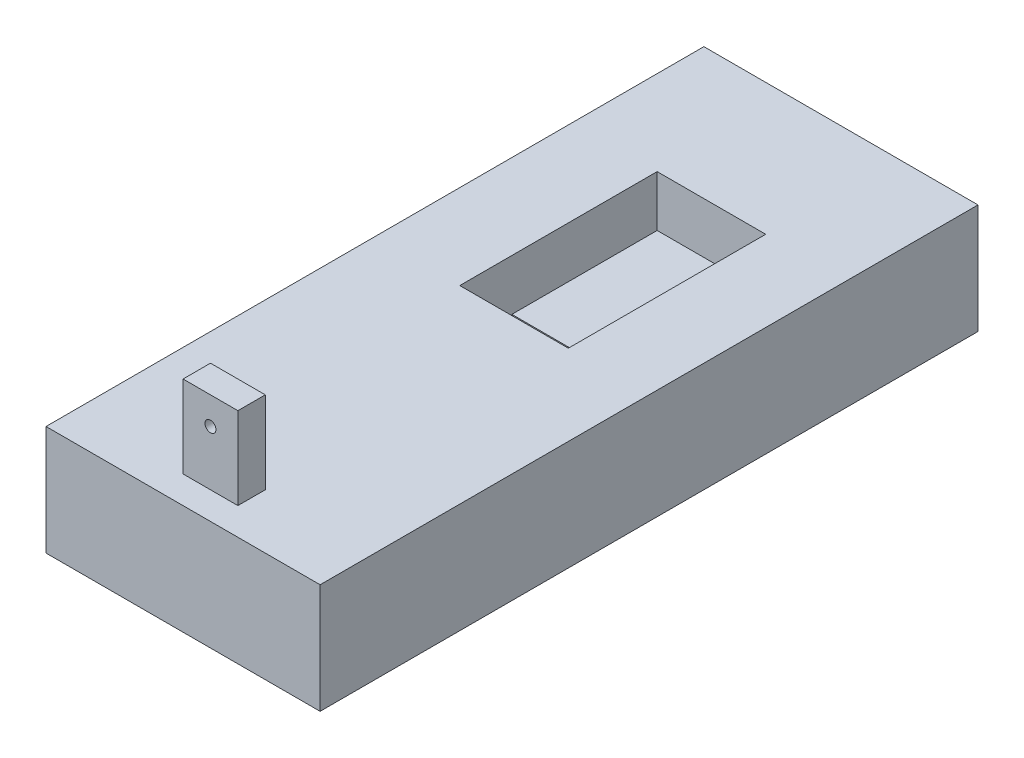
ISO-10303-21;
HEADER;
FILE_DESCRIPTION(('STEP AP214'),'2;1');
FILE_NAME('part.step','',(''),(''),'','','');
FILE_SCHEMA(('AUTOMOTIVE_DESIGN { 1 0 10303 214 1 1 1 1 }'));
ENDSEC;
DATA;
#1=APPLICATION_CONTEXT('core data for automotive mechanical design processes');
#2=APPLICATION_PROTOCOL_DEFINITION('international standard','automotive_design',2000,#1);
#3=PRODUCT_CONTEXT('',#1,'mechanical');
#4=PRODUCT('Part','Part','',(#3));
#5=PRODUCT_RELATED_PRODUCT_CATEGORY('part','',(#4));
#6=PRODUCT_DEFINITION_FORMATION('','',#4);
#7=PRODUCT_DEFINITION_CONTEXT('part definition',#1,'design');
#8=PRODUCT_DEFINITION('design','',#6,#7);
#9=PRODUCT_DEFINITION_SHAPE('','',#8);
#10=(LENGTH_UNIT() NAMED_UNIT(*) SI_UNIT(.MILLI.,.METRE.));
#11=(NAMED_UNIT(*) PLANE_ANGLE_UNIT() SI_UNIT($,.RADIAN.));
#12=(NAMED_UNIT(*) SI_UNIT($,.STERADIAN.) SOLID_ANGLE_UNIT());
#13=UNCERTAINTY_MEASURE_WITH_UNIT(LENGTH_MEASURE(1.E-05),#10,'distance_accuracy_value','');
#14=(GEOMETRIC_REPRESENTATION_CONTEXT(3) GLOBAL_UNCERTAINTY_ASSIGNED_CONTEXT((#13)) GLOBAL_UNIT_ASSIGNED_CONTEXT((#10,
#11,#12)) REPRESENTATION_CONTEXT('',''));
#15=CARTESIAN_POINT('',(0.,0.,0.));
#16=DIRECTION('',(0.,0.,1.));
#17=DIRECTION('',(1.,0.,0.));
#18=AXIS2_PLACEMENT_3D('',#15,#16,#17);
#19=CARTESIAN_POINT('',(0.,10.7,0.));
#20=DIRECTION('',(0.,1.,0.));
#21=DIRECTION('',(0.,0.,1.));
#22=AXIS2_PLACEMENT_3D('',#19,#20,#21);
#23=PLANE('',#22);
#24=DIRECTION('',(1.,0.,0.));
#25=VECTOR('',#24,1.);
#26=CARTESIAN_POINT('',(-13.2314416448776,10.7,-61.1811266936059));
#27=LINE('',#26,#25);
#28=CARTESIAN_POINT('',(-13.2314416448776,10.7,-61.1811266936059));
#29=VERTEX_POINT('',#28);
#30=CARTESIAN_POINT('',(6.56855835512243,10.7,-61.1811266936059));
#31=VERTEX_POINT('',#30);
#32=EDGE_CURVE('E175',#29,#31,#27,.T.);
#33=ORIENTED_EDGE('',*,*,#32,.F.);
#34=DIRECTION('',(0.,0.,1.));
#35=VECTOR('',#34,1.);
#36=CARTESIAN_POINT('',(-13.2314416448776,10.7,-54.1811266936059));
#37=LINE('',#36,#35);
#38=CARTESIAN_POINT('',(-13.2314416448776,10.7,-54.1811266936059));
#39=VERTEX_POINT('',#38);
#40=EDGE_CURVE('E157',#29,#39,#37,.T.);
#41=ORIENTED_EDGE('',*,*,#40,.T.);
#42=DIRECTION('',(1.,0.,0.));
#43=VECTOR('',#42,1.);
#44=CARTESIAN_POINT('',(6.56855835512243,10.7,-54.1811266936059));
#45=LINE('',#44,#43);
#46=CARTESIAN_POINT('',(6.56855835512243,10.7,-54.1811266936059));
#47=VERTEX_POINT('',#46);
#48=EDGE_CURVE('E195',#39,#47,#45,.T.);
#49=ORIENTED_EDGE('',*,*,#48,.T.);
#50=DIRECTION('',(0.,0.,-1.));
#51=VECTOR('',#50,1.);
#52=CARTESIAN_POINT('',(6.56855835512243,10.7,-54.1811266936059));
#53=LINE('',#52,#51);
#54=EDGE_CURVE('E185',#47,#31,#53,.T.);
#55=ORIENTED_EDGE('',*,*,#54,.T.);
#56=EDGE_LOOP('',(#33,#41,#49,#55));
#57=FACE_BOUND('',#56,.T.);
#58=ADVANCED_FACE('F33',(#57),#23,.T.);
#59=CARTESIAN_POINT('',(0.,20.,0.));
#60=DIRECTION('',(0.,1.,0.));
#61=DIRECTION('',(0.,0.,1.));
#62=AXIS2_PLACEMENT_3D('',#59,#60,#61);
#63=PLANE('',#62);
#64=DIRECTION('',(0.,0.,-1.));
#65=VECTOR('',#64,1.);
#66=CARTESIAN_POINT('',(6.56855835512243,20.,-54.1811266936059));
#67=LINE('',#66,#65);
#68=CARTESIAN_POINT('',(6.56855835512243,20.,-54.1811266936059));
#69=VERTEX_POINT('',#68);
#70=CARTESIAN_POINT('',(6.56855835512243,20.,-90.1811266936059));
#71=VERTEX_POINT('',#70);
#72=EDGE_CURVE('E57',#69,#71,#67,.T.);
#73=ORIENTED_EDGE('',*,*,#72,.F.);
#74=DIRECTION('',(1.,0.,0.));
#75=VECTOR('',#74,1.);
#76=CARTESIAN_POINT('',(6.56855835512243,20.,-54.1811266936059));
#77=LINE('',#76,#75);
#78=CARTESIAN_POINT('',(-13.2314416448776,20.,-54.1811266936059));
#79=VERTEX_POINT('',#78);
#80=EDGE_CURVE('E205',#79,#69,#77,.T.);
#81=ORIENTED_EDGE('',*,*,#80,.F.);
#82=DIRECTION('',(0.,0.,1.));
#83=VECTOR('',#82,1.);
#84=CARTESIAN_POINT('',(-13.2314416448776,20.,-54.1811266936059));
#85=LINE('',#84,#83);
#86=CARTESIAN_POINT('',(-13.2314416448776,20.,-90.1811266936059));
#87=VERTEX_POINT('',#86);
#88=EDGE_CURVE('E203',#87,#79,#85,.T.);
#89=ORIENTED_EDGE('',*,*,#88,.F.);
#90=DIRECTION('',(-1.,0.,0.));
#91=VECTOR('',#90,1.);
#92=CARTESIAN_POINT('',(6.56855835512243,20.,-90.1811266936059));
#93=LINE('',#92,#91);
#94=EDGE_CURVE('E200',#71,#87,#93,.T.);
#95=ORIENTED_EDGE('',*,*,#94,.F.);
#96=EDGE_LOOP('',(#73,#81,#89,#95));
#97=FACE_BOUND('',#96,.T.);
#98=DIRECTION('',(0.,0.,1.));
#99=VECTOR('',#98,1.);
#100=CARTESIAN_POINT('',(-28.7064416448776,20.,-114.181126693606));
#101=LINE('',#100,#99);
#102=CARTESIAN_POINT('',(-28.7064416448776,20.,-114.181126693606));
#103=VERTEX_POINT('',#102);
#104=CARTESIAN_POINT('',(-28.7064416448776,20.,5.81887330639411));
#105=VERTEX_POINT('',#104);
#106=EDGE_CURVE('E252',#103,#105,#101,.T.);
#107=ORIENTED_EDGE('',*,*,#106,.T.);
#108=DIRECTION('',(1.,0.,0.));
#109=VECTOR('',#108,1.);
#110=CARTESIAN_POINT('',(-28.7064416448776,20.,5.81887330639411));
#111=LINE('',#110,#109);
#112=CARTESIAN_POINT('',(21.2935583551224,20.,5.81887330639411));
#113=VERTEX_POINT('',#112);
#114=EDGE_CURVE('E255',#105,#113,#111,.T.);
#115=ORIENTED_EDGE('',*,*,#114,.T.);
#116=DIRECTION('',(0.,0.,-1.));
#117=VECTOR('',#116,1.);
#118=CARTESIAN_POINT('',(21.2935583551224,20.,-114.181126693606));
#119=LINE('',#118,#117);
#120=CARTESIAN_POINT('',(21.2935583551224,20.,-114.181126693606));
#121=VERTEX_POINT('',#120);
#122=EDGE_CURVE('E258',#113,#121,#119,.T.);
#123=ORIENTED_EDGE('',*,*,#122,.T.);
#124=DIRECTION('',(-1.,0.,0.));
#125=VECTOR('',#124,1.);
#126=CARTESIAN_POINT('',(-28.7064416448776,20.,-114.181126693606));
#127=LINE('',#126,#125);
#128=EDGE_CURVE('E260',#121,#103,#127,.T.);
#129=ORIENTED_EDGE('',*,*,#128,.T.);
#130=EDGE_LOOP('',(#107,#115,#123,#129));
#131=FACE_BOUND('',#130,.T.);
#132=DIRECTION('',(-1.,0.,0.));
#133=VECTOR('',#132,1.);
#134=CARTESIAN_POINT('',(1.29355835512243,20.,-4.18112669360589));
#135=LINE('',#134,#133);
#136=CARTESIAN_POINT('',(1.29355835512243,20.,-4.18112669360589));
#137=VERTEX_POINT('',#136);
#138=CARTESIAN_POINT('',(-8.70644164487756,20.,-4.18112669360589));
#139=VERTEX_POINT('',#138);
#140=EDGE_CURVE('E234',#137,#139,#135,.T.);
#141=ORIENTED_EDGE('',*,*,#140,.F.);
#142=DIRECTION('',(0.,0.,-1.));
#143=VECTOR('',#142,1.);
#144=CARTESIAN_POINT('',(1.29355835512243,20.,0.818873306394109));
#145=LINE('',#144,#143);
#146=CARTESIAN_POINT('',(1.29355835512243,20.,0.818873306394109));
#147=VERTEX_POINT('',#146);
#148=EDGE_CURVE('E231',#147,#137,#145,.T.);
#149=ORIENTED_EDGE('',*,*,#148,.F.);
#150=DIRECTION('',(-1.,0.,0.));
#151=VECTOR('',#150,1.);
#152=CARTESIAN_POINT('',(1.29355835512243,20.,0.818873306394109));
#153=LINE('',#152,#151);
#154=CARTESIAN_POINT('',(-8.70644164487756,20.,0.81887330639411));
#155=VERTEX_POINT('',#154);
#156=EDGE_CURVE('E222',#147,#155,#153,.T.);
#157=ORIENTED_EDGE('',*,*,#156,.T.);
#158=DIRECTION('',(0.,0.,-1.));
#159=VECTOR('',#158,1.);
#160=CARTESIAN_POINT('',(-8.70644164487756,20.,0.81887330639411));
#161=LINE('',#160,#159);
#162=EDGE_CURVE('E237',#155,#139,#161,.T.);
#163=ORIENTED_EDGE('',*,*,#162,.T.);
#164=EDGE_LOOP('',(#141,#149,#157,#163));
#165=FACE_BOUND('',#164,.T.);
#166=ADVANCED_FACE('F295',(#97,#131,#165),#63,.T.);
#167=CARTESIAN_POINT('',(-28.7064416448776,20.,-114.181126693606));
#168=DIRECTION('',(1.,0.,0.));
#169=DIRECTION('',(0.,0.,-1.));
#170=AXIS2_PLACEMENT_3D('',#167,#168,#169);
#171=PLANE('',#170);
#172=DIRECTION('',(0.,0.,1.));
#173=VECTOR('',#172,1.);
#174=CARTESIAN_POINT('',(-28.7064416448776,0.,-114.181126693606));
#175=LINE('',#174,#173);
#176=CARTESIAN_POINT('',(-28.7064416448776,0.,-114.181126693606));
#177=VERTEX_POINT('',#176);
#178=CARTESIAN_POINT('',(-28.7064416448776,0.,5.81887330639411));
#179=VERTEX_POINT('',#178);
#180=EDGE_CURVE('E251',#177,#179,#175,.T.);
#181=ORIENTED_EDGE('',*,*,#180,.T.);
#182=DIRECTION('',(0.,-1.,0.));
#183=VECTOR('',#182,1.);
#184=CARTESIAN_POINT('',(-28.7064416448776,20.,5.81887330639411));
#185=LINE('',#184,#183);
#186=EDGE_CURVE('E11',#105,#179,#185,.T.);
#187=ORIENTED_EDGE('',*,*,#186,.F.);
#188=ORIENTED_EDGE('',*,*,#106,.F.);
#189=DIRECTION('',(0.,-1.,0.));
#190=VECTOR('',#189,1.);
#191=CARTESIAN_POINT('',(-28.7064416448776,20.,-114.181126693606));
#192=LINE('',#191,#190);
#193=EDGE_CURVE('E262',#103,#177,#192,.T.);
#194=ORIENTED_EDGE('',*,*,#193,.T.);
#195=EDGE_LOOP('',(#181,#187,#188,#194));
#196=FACE_BOUND('',#195,.T.);
#197=ADVANCED_FACE('F35',(#196),#171,.F.);
#198=CARTESIAN_POINT('',(-28.7064416448776,20.,5.81887330639411));
#199=DIRECTION('',(0.,0.,-1.));
#200=DIRECTION('',(-1.,0.,0.));
#201=AXIS2_PLACEMENT_3D('',#198,#199,#200);
#202=PLANE('',#201);
#203=DIRECTION('',(1.,0.,0.));
#204=VECTOR('',#203,1.);
#205=CARTESIAN_POINT('',(-28.7064416448776,0.,5.81887330639411));
#206=LINE('',#205,#204);
#207=CARTESIAN_POINT('',(21.2935583551224,0.,5.81887330639411));
#208=VERTEX_POINT('',#207);
#209=EDGE_CURVE('E265',#179,#208,#206,.T.);
#210=ORIENTED_EDGE('',*,*,#209,.T.);
#211=DIRECTION('',(0.,-1.,0.));
#212=VECTOR('',#211,1.);
#213=CARTESIAN_POINT('',(21.2935583551224,20.,5.81887330639411));
#214=LINE('',#213,#212);
#215=EDGE_CURVE('E42',#113,#208,#214,.T.);
#216=ORIENTED_EDGE('',*,*,#215,.F.);
#217=ORIENTED_EDGE('',*,*,#114,.F.);
#218=ORIENTED_EDGE('',*,*,#186,.T.);
#219=EDGE_LOOP('',(#210,#216,#217,#218));
#220=FACE_BOUND('',#219,.T.);
#221=ADVANCED_FACE('F297',(#220),#202,.F.);
#222=CARTESIAN_POINT('',(21.2935583551224,20.,-114.181126693606));
#223=DIRECTION('',(-1.,0.,0.));
#224=DIRECTION('',(0.,0.,1.));
#225=AXIS2_PLACEMENT_3D('',#222,#223,#224);
#226=PLANE('',#225);
#227=DIRECTION('',(0.,0.,-1.));
#228=VECTOR('',#227,1.);
#229=CARTESIAN_POINT('',(21.2935583551224,0.,-114.181126693606));
#230=LINE('',#229,#228);
#231=CARTESIAN_POINT('',(21.2935583551224,0.,-114.181126693606));
#232=VERTEX_POINT('',#231);
#233=EDGE_CURVE('E267',#208,#232,#230,.T.);
#234=ORIENTED_EDGE('',*,*,#233,.T.);
#235=DIRECTION('',(0.,-1.,0.));
#236=VECTOR('',#235,1.);
#237=CARTESIAN_POINT('',(21.2935583551224,20.,-114.181126693606));
#238=LINE('',#237,#236);
#239=EDGE_CURVE('E272',#121,#232,#238,.T.);
#240=ORIENTED_EDGE('',*,*,#239,.F.);
#241=ORIENTED_EDGE('',*,*,#122,.F.);
#242=ORIENTED_EDGE('',*,*,#215,.T.);
#243=EDGE_LOOP('',(#234,#240,#241,#242));
#244=FACE_BOUND('',#243,.T.);
#245=ADVANCED_FACE('F280',(#244),#226,.F.);
#246=CARTESIAN_POINT('',(-28.7064416448776,20.,-114.181126693606));
#247=DIRECTION('',(0.,0.,1.));
#248=DIRECTION('',(1.,0.,0.));
#249=AXIS2_PLACEMENT_3D('',#246,#247,#248);
#250=PLANE('',#249);
#251=DIRECTION('',(-1.,0.,0.));
#252=VECTOR('',#251,1.);
#253=CARTESIAN_POINT('',(-28.7064416448776,0.,-114.181126693606));
#254=LINE('',#253,#252);
#255=EDGE_CURVE('E256',#232,#177,#254,.T.);
#256=ORIENTED_EDGE('',*,*,#255,.T.);
#257=ORIENTED_EDGE('',*,*,#193,.F.);
#258=ORIENTED_EDGE('',*,*,#128,.F.);
#259=ORIENTED_EDGE('',*,*,#239,.T.);
#260=EDGE_LOOP('',(#256,#257,#258,#259));
#261=FACE_BOUND('',#260,.T.);
#262=ADVANCED_FACE('F289',(#261),#250,.F.);
#263=CARTESIAN_POINT('',(0.,0.,0.));
#264=DIRECTION('',(0.,1.,0.));
#265=DIRECTION('',(0.,0.,1.));
#266=AXIS2_PLACEMENT_3D('',#263,#264,#265);
#267=PLANE('',#266);
#268=ORIENTED_EDGE('',*,*,#180,.F.);
#269=ORIENTED_EDGE('',*,*,#255,.F.);
#270=ORIENTED_EDGE('',*,*,#233,.F.);
#271=ORIENTED_EDGE('',*,*,#209,.F.);
#272=EDGE_LOOP('',(#268,#269,#270,#271));
#273=FACE_BOUND('',#272,.T.);
#274=ADVANCED_FACE('F286',(#273),#267,.F.);
#275=CARTESIAN_POINT('',(1.29355835512243,35.,0.818873306394109));
#276=DIRECTION('',(-1.,0.,0.));
#277=DIRECTION('',(0.,0.,1.));
#278=AXIS2_PLACEMENT_3D('',#275,#276,#277);
#279=PLANE('',#278);
#280=ORIENTED_EDGE('',*,*,#148,.T.);
#281=DIRECTION('',(0.,-1.,0.));
#282=VECTOR('',#281,1.);
#283=CARTESIAN_POINT('',(1.29355835512243,35.,-4.18112669360589));
#284=LINE('',#283,#282);
#285=CARTESIAN_POINT('',(1.29355835512243,35.,-4.18112669360589));
#286=VERTEX_POINT('',#285);
#287=EDGE_CURVE('E248',#286,#137,#284,.T.);
#288=ORIENTED_EDGE('',*,*,#287,.F.);
#289=DIRECTION('',(0.,0.,-1.));
#290=VECTOR('',#289,1.);
#291=CARTESIAN_POINT('',(1.29355835512243,35.,0.818873306394109));
#292=LINE('',#291,#290);
#293=CARTESIAN_POINT('',(1.29355835512243,35.,0.818873306394109));
#294=VERTEX_POINT('',#293);
#295=EDGE_CURVE('E218',#294,#286,#292,.T.);
#296=ORIENTED_EDGE('',*,*,#295,.F.);
#297=DIRECTION('',(0.,-1.,0.));
#298=VECTOR('',#297,1.);
#299=CARTESIAN_POINT('',(1.29355835512243,35.,0.818873306394109));
#300=LINE('',#299,#298);
#301=EDGE_CURVE('E230',#294,#147,#300,.T.);
#302=ORIENTED_EDGE('',*,*,#301,.T.);
#303=EDGE_LOOP('',(#280,#288,#296,#302));
#304=FACE_BOUND('',#303,.T.);
#305=ADVANCED_FACE('F364',(#304),#279,.F.);
#306=CARTESIAN_POINT('',(1.29355835512243,35.,-4.18112669360589));
#307=DIRECTION('',(0.,0.,1.));
#308=DIRECTION('',(1.,0.,0.));
#309=AXIS2_PLACEMENT_3D('',#306,#307,#308);
#310=PLANE('',#309);
#311=CARTESIAN_POINT('',(-3.70644164487757,30.,-4.18112669360589));
#312=DIRECTION('',(0.,0.,-1.));
#313=DIRECTION('',(-1.,0.,0.));
#314=AXIS2_PLACEMENT_3D('',#311,#312,#313);
#315=CIRCLE('',#314,1.);
#316=CARTESIAN_POINT('',(-4.70644164487757,30.,-4.18112669360589));
#317=VERTEX_POINT('',#316);
#318=EDGE_CURVE('E210',#317,#317,#315,.T.);
#319=ORIENTED_EDGE('',*,*,#318,.F.);
#320=EDGE_LOOP('',(#319));
#321=FACE_BOUND('',#320,.T.);
#322=ORIENTED_EDGE('',*,*,#140,.T.);
#323=DIRECTION('',(0.,-1.,0.));
#324=VECTOR('',#323,1.);
#325=CARTESIAN_POINT('',(-8.70644164487756,35.,-4.18112669360589));
#326=LINE('',#325,#324);
#327=CARTESIAN_POINT('',(-8.70644164487756,35.,-4.18112669360589));
#328=VERTEX_POINT('',#327);
#329=EDGE_CURVE('E245',#328,#139,#326,.T.);
#330=ORIENTED_EDGE('',*,*,#329,.F.);
#331=DIRECTION('',(-1.,0.,0.));
#332=VECTOR('',#331,1.);
#333=CARTESIAN_POINT('',(1.29355835512243,35.,-4.18112669360589));
#334=LINE('',#333,#332);
#335=EDGE_CURVE('E221',#286,#328,#334,.T.);
#336=ORIENTED_EDGE('',*,*,#335,.F.);
#337=ORIENTED_EDGE('',*,*,#287,.T.);
#338=EDGE_LOOP('',(#322,#330,#336,#337));
#339=FACE_BOUND('',#338,.T.);
#340=ADVANCED_FACE('F360',(#321,#339),#310,.F.);
#341=CARTESIAN_POINT('',(-8.70644164487756,35.,0.81887330639411));
#342=DIRECTION('',(-1.,0.,0.));
#343=DIRECTION('',(0.,0.,1.));
#344=AXIS2_PLACEMENT_3D('',#341,#342,#343);
#345=PLANE('',#344);
#346=ORIENTED_EDGE('',*,*,#162,.F.);
#347=DIRECTION('',(0.,-1.,0.));
#348=VECTOR('',#347,1.);
#349=CARTESIAN_POINT('',(-8.70644164487756,35.,0.81887330639411));
#350=LINE('',#349,#348);
#351=CARTESIAN_POINT('',(-8.70644164487756,35.,0.81887330639411));
#352=VERTEX_POINT('',#351);
#353=EDGE_CURVE('E242',#352,#155,#350,.T.);
#354=ORIENTED_EDGE('',*,*,#353,.F.);
#355=DIRECTION('',(0.,0.,-1.));
#356=VECTOR('',#355,1.);
#357=CARTESIAN_POINT('',(-8.70644164487756,35.,0.81887330639411));
#358=LINE('',#357,#356);
#359=EDGE_CURVE('E224',#352,#328,#358,.T.);
#360=ORIENTED_EDGE('',*,*,#359,.T.);
#361=ORIENTED_EDGE('',*,*,#329,.T.);
#362=EDGE_LOOP('',(#346,#354,#360,#361));
#363=FACE_BOUND('',#362,.T.);
#364=ADVANCED_FACE('F356',(#363),#345,.T.);
#365=CARTESIAN_POINT('',(1.29355835512243,35.,0.818873306394109));
#366=DIRECTION('',(0.,0.,1.));
#367=DIRECTION('',(1.,0.,0.));
#368=AXIS2_PLACEMENT_3D('',#365,#366,#367);
#369=PLANE('',#368);
#370=CARTESIAN_POINT('',(-3.70644164487757,30.,0.81887330639411));
#371=DIRECTION('',(0.,0.,1.));
#372=DIRECTION('',(1.,0.,0.));
#373=AXIS2_PLACEMENT_3D('',#370,#371,#372);
#374=CIRCLE('',#373,1.);
#375=CARTESIAN_POINT('',(-2.70644164487757,30.,0.81887330639411));
#376=VERTEX_POINT('',#375);
#377=EDGE_CURVE('E37',#376,#376,#374,.T.);
#378=ORIENTED_EDGE('',*,*,#377,.F.);
#379=EDGE_LOOP('',(#378));
#380=FACE_BOUND('',#379,.T.);
#381=ORIENTED_EDGE('',*,*,#156,.F.);
#382=ORIENTED_EDGE('',*,*,#301,.F.);
#383=DIRECTION('',(-1.,0.,0.));
#384=VECTOR('',#383,1.);
#385=CARTESIAN_POINT('',(1.29355835512243,35.,0.818873306394109));
#386=LINE('',#385,#384);
#387=EDGE_CURVE('E227',#294,#352,#386,.T.);
#388=ORIENTED_EDGE('',*,*,#387,.T.);
#389=ORIENTED_EDGE('',*,*,#353,.T.);
#390=EDGE_LOOP('',(#381,#382,#388,#389));
#391=FACE_BOUND('',#390,.T.);
#392=ADVANCED_FACE('F352',(#380,#391),#369,.T.);
#393=CARTESIAN_POINT('',(0.,35.,0.));
#394=DIRECTION('',(0.,1.,0.));
#395=DIRECTION('',(0.,0.,1.));
#396=AXIS2_PLACEMENT_3D('',#393,#394,#395);
#397=PLANE('',#396);
#398=ORIENTED_EDGE('',*,*,#295,.T.);
#399=ORIENTED_EDGE('',*,*,#335,.T.);
#400=ORIENTED_EDGE('',*,*,#359,.F.);
#401=ORIENTED_EDGE('',*,*,#387,.F.);
#402=EDGE_LOOP('',(#398,#399,#400,#401));
#403=FACE_BOUND('',#402,.T.);
#404=ADVANCED_FACE('F348',(#403),#397,.T.);
#405=CARTESIAN_POINT('',(-3.70644164487757,30.,5.81887330639411));
#406=DIRECTION('',(0.,0.,-1.));
#407=DIRECTION('',(-1.,0.,0.));
#408=AXIS2_PLACEMENT_3D('',#405,#406,#407);
#409=CYLINDRICAL_SURFACE('',#408,1.);
#410=ORIENTED_EDGE('',*,*,#377,.T.);
#411=EDGE_LOOP('',(#410));
#412=FACE_BOUND('',#411,.T.);
#413=ORIENTED_EDGE('',*,*,#318,.T.);
#414=EDGE_LOOP('',(#413));
#415=FACE_BOUND('',#414,.T.);
#416=ADVANCED_FACE('F343',(#412,#415),#409,.F.);
#417=CARTESIAN_POINT('',(6.56855835512243,10.7,-54.1811266936059));
#418=DIRECTION('',(1.,0.,0.));
#419=DIRECTION('',(0.,0.,-1.));
#420=AXIS2_PLACEMENT_3D('',#417,#418,#419);
#421=PLANE('',#420);
#422=ORIENTED_EDGE('',*,*,#72,.T.);
#423=DIRECTION('',(0.,1.,0.));
#424=VECTOR('',#423,1.);
#425=CARTESIAN_POINT('',(6.56855835512243,10.7,-90.1811266936059));
#426=LINE('',#425,#424);
#427=CARTESIAN_POINT('',(6.56855835512243,10.7,-90.1811266936059));
#428=VERTEX_POINT('',#427);
#429=EDGE_CURVE('E198',#428,#71,#426,.T.);
#430=ORIENTED_EDGE('',*,*,#429,.F.);
#431=CARTESIAN_POINT('',(6.56855835512243,10.7,-63.6811266936059));
#432=VERTEX_POINT('',#431);
#433=EDGE_CURVE('E189',#432,#428,#53,.T.);
#434=ORIENTED_EDGE('',*,*,#433,.F.);
#435=DIRECTION('',(0.,1.,0.));
#436=VECTOR('',#435,1.);
#437=CARTESIAN_POINT('',(6.56855835512243,3.6,-63.6811266936059));
#438=LINE('',#437,#436);
#439=CARTESIAN_POINT('',(6.56855835512243,3.6,-63.6811266936059));
#440=VERTEX_POINT('',#439);
#441=EDGE_CURVE('E49',#440,#432,#438,.T.);
#442=ORIENTED_EDGE('',*,*,#441,.F.);
#443=DIRECTION('',(0.,0.,-1.));
#444=VECTOR('',#443,1.);
#445=CARTESIAN_POINT('',(6.56855835512243,3.6,-61.1811266936059));
#446=LINE('',#445,#444);
#447=CARTESIAN_POINT('',(6.56855835512243,3.6,-61.1811266936059));
#448=VERTEX_POINT('',#447);
#449=EDGE_CURVE('E170',#448,#440,#446,.T.);
#450=ORIENTED_EDGE('',*,*,#449,.F.);
#451=DIRECTION('',(0.,1.,0.));
#452=VECTOR('',#451,1.);
#453=CARTESIAN_POINT('',(6.56855835512243,3.6,-61.1811266936059));
#454=LINE('',#453,#452);
#455=EDGE_CURVE('E161',#448,#31,#454,.T.);
#456=ORIENTED_EDGE('',*,*,#455,.T.);
#457=ORIENTED_EDGE('',*,*,#54,.F.);
#458=DIRECTION('',(0.,1.,0.));
#459=VECTOR('',#458,1.);
#460=CARTESIAN_POINT('',(6.56855835512243,10.7,-54.1811266936059));
#461=LINE('',#460,#459);
#462=EDGE_CURVE('E208',#47,#69,#461,.T.);
#463=ORIENTED_EDGE('',*,*,#462,.T.);
#464=EDGE_LOOP('',(#422,#430,#434,#442,#450,#456,#457,#463));
#465=FACE_BOUND('',#464,.T.);
#466=ADVANCED_FACE('F328',(#465),#421,.F.);
#467=CARTESIAN_POINT('',(6.56855835512243,10.7,-54.1811266936059));
#468=DIRECTION('',(0.,0.,1.));
#469=DIRECTION('',(1.,0.,0.));
#470=AXIS2_PLACEMENT_3D('',#467,#468,#469);
#471=PLANE('',#470);
#472=ORIENTED_EDGE('',*,*,#80,.T.);
#473=ORIENTED_EDGE('',*,*,#462,.F.);
#474=ORIENTED_EDGE('',*,*,#48,.F.);
#475=DIRECTION('',(0.,1.,0.));
#476=VECTOR('',#475,1.);
#477=CARTESIAN_POINT('',(-13.2314416448776,10.7,-54.1811266936059));
#478=LINE('',#477,#476);
#479=EDGE_CURVE('E211',#39,#79,#478,.T.);
#480=ORIENTED_EDGE('',*,*,#479,.T.);
#481=EDGE_LOOP('',(#472,#473,#474,#480));
#482=FACE_BOUND('',#481,.T.);
#483=ADVANCED_FACE('F335',(#482),#471,.F.);
#484=CARTESIAN_POINT('',(-13.2314416448776,10.7,-54.1811266936059));
#485=DIRECTION('',(-1.,0.,0.));
#486=DIRECTION('',(0.,0.,1.));
#487=AXIS2_PLACEMENT_3D('',#484,#485,#486);
#488=PLANE('',#487);
#489=ORIENTED_EDGE('',*,*,#88,.T.);
#490=ORIENTED_EDGE('',*,*,#479,.F.);
#491=ORIENTED_EDGE('',*,*,#40,.F.);
#492=DIRECTION('',(0.,1.,0.));
#493=VECTOR('',#492,1.);
#494=CARTESIAN_POINT('',(-13.2314416448776,3.6,-61.1811266936059));
#495=LINE('',#494,#493);
#496=CARTESIAN_POINT('',(-13.2314416448776,3.6,-61.1811266936059));
#497=VERTEX_POINT('',#496);
#498=EDGE_CURVE('E149',#497,#29,#495,.T.);
#499=ORIENTED_EDGE('',*,*,#498,.F.);
#500=DIRECTION('',(0.,0.,1.));
#501=VECTOR('',#500,1.);
#502=CARTESIAN_POINT('',(-13.2314416448776,3.6,-61.1811266936059));
#503=LINE('',#502,#501);
#504=CARTESIAN_POINT('',(-13.2314416448776,3.6,-63.6811266936059));
#505=VERTEX_POINT('',#504);
#506=EDGE_CURVE('E154',#505,#497,#503,.T.);
#507=ORIENTED_EDGE('',*,*,#506,.F.);
#508=DIRECTION('',(0.,1.,0.));
#509=VECTOR('',#508,1.);
#510=CARTESIAN_POINT('',(-13.2314416448776,3.6,-63.6811266936059));
#511=LINE('',#510,#509);
#512=CARTESIAN_POINT('',(-13.2314416448776,10.7,-63.6811266936059));
#513=VERTEX_POINT('',#512);
#514=EDGE_CURVE('E181',#505,#513,#511,.T.);
#515=ORIENTED_EDGE('',*,*,#514,.T.);
#516=CARTESIAN_POINT('',(-13.2314416448776,10.7,-90.1811266936059));
#517=VERTEX_POINT('',#516);
#518=EDGE_CURVE('E192',#517,#513,#37,.T.);
#519=ORIENTED_EDGE('',*,*,#518,.F.);
#520=DIRECTION('',(0.,1.,0.));
#521=VECTOR('',#520,1.);
#522=CARTESIAN_POINT('',(-13.2314416448776,10.7,-90.1811266936059));
#523=LINE('',#522,#521);
#524=EDGE_CURVE('E213',#517,#87,#523,.T.);
#525=ORIENTED_EDGE('',*,*,#524,.T.);
#526=EDGE_LOOP('',(#489,#490,#491,#499,#507,#515,#519,#525));
#527=FACE_BOUND('',#526,.T.);
#528=ADVANCED_FACE('F152',(#527),#488,.F.);
#529=CARTESIAN_POINT('',(6.56855835512243,10.7,-90.1811266936059));
#530=DIRECTION('',(0.,0.,-1.));
#531=DIRECTION('',(-1.,0.,0.));
#532=AXIS2_PLACEMENT_3D('',#529,#530,#531);
#533=PLANE('',#532);
#534=ORIENTED_EDGE('',*,*,#94,.T.);
#535=ORIENTED_EDGE('',*,*,#524,.F.);
#536=DIRECTION('',(-1.,0.,0.));
#537=VECTOR('',#536,1.);
#538=CARTESIAN_POINT('',(6.56855835512243,10.7,-90.1811266936059));
#539=LINE('',#538,#537);
#540=EDGE_CURVE('E188',#428,#517,#539,.T.);
#541=ORIENTED_EDGE('',*,*,#540,.F.);
#542=ORIENTED_EDGE('',*,*,#429,.T.);
#543=EDGE_LOOP('',(#534,#535,#541,#542));
#544=FACE_BOUND('',#543,.T.);
#545=ADVANCED_FACE('F317',(#544),#533,.F.);
#546=DIRECTION('',(-1.,0.,0.));
#547=VECTOR('',#546,1.);
#548=CARTESIAN_POINT('',(-13.2314416448776,10.7,-63.6811266936059));
#549=LINE('',#548,#547);
#550=EDGE_CURVE('E173',#432,#513,#549,.T.);
#551=ORIENTED_EDGE('',*,*,#550,.F.);
#552=ORIENTED_EDGE('',*,*,#433,.T.);
#553=ORIENTED_EDGE('',*,*,#540,.T.);
#554=ORIENTED_EDGE('',*,*,#518,.T.);
#555=EDGE_LOOP('',(#551,#552,#553,#554));
#556=FACE_BOUND('',#555,.T.);
#557=ADVANCED_FACE('F307',(#556),#23,.T.);
#558=CARTESIAN_POINT('',(-13.2314416448776,3.6,-63.6811266936059));
#559=DIRECTION('',(0.,0.,-1.));
#560=DIRECTION('',(-1.,0.,0.));
#561=AXIS2_PLACEMENT_3D('',#558,#559,#560);
#562=PLANE('',#561);
#563=ORIENTED_EDGE('',*,*,#550,.T.);
#564=ORIENTED_EDGE('',*,*,#514,.F.);
#565=DIRECTION('',(-1.,0.,0.));
#566=VECTOR('',#565,1.);
#567=CARTESIAN_POINT('',(-13.2314416448776,3.6,-63.6811266936059));
#568=LINE('',#567,#566);
#569=EDGE_CURVE('E162',#440,#505,#568,.T.);
#570=ORIENTED_EDGE('',*,*,#569,.F.);
#571=ORIENTED_EDGE('',*,*,#441,.T.);
#572=EDGE_LOOP('',(#563,#564,#570,#571));
#573=FACE_BOUND('',#572,.T.);
#574=ADVANCED_FACE('F316',(#573),#562,.F.);
#575=CARTESIAN_POINT('',(-13.2314416448776,3.6,-61.1811266936059));
#576=DIRECTION('',(0.,0.,1.));
#577=DIRECTION('',(1.,0.,0.));
#578=AXIS2_PLACEMENT_3D('',#575,#576,#577);
#579=PLANE('',#578);
#580=ORIENTED_EDGE('',*,*,#32,.T.);
#581=ORIENTED_EDGE('',*,*,#455,.F.);
#582=DIRECTION('',(1.,0.,0.));
#583=VECTOR('',#582,1.);
#584=CARTESIAN_POINT('',(-13.2314416448776,3.6,-61.1811266936059));
#585=LINE('',#584,#583);
#586=EDGE_CURVE('E165',#497,#448,#585,.T.);
#587=ORIENTED_EDGE('',*,*,#586,.F.);
#588=ORIENTED_EDGE('',*,*,#498,.T.);
#589=EDGE_LOOP('',(#580,#581,#587,#588));
#590=FACE_BOUND('',#589,.T.);
#591=ADVANCED_FACE('F166',(#590),#579,.F.);
#592=CARTESIAN_POINT('',(0.,3.6,0.));
#593=DIRECTION('',(0.,-1.,0.));
#594=DIRECTION('',(0.,0.,-1.));
#595=AXIS2_PLACEMENT_3D('',#592,#593,#594);
#596=PLANE('',#595);
#597=ORIENTED_EDGE('',*,*,#506,.T.);
#598=ORIENTED_EDGE('',*,*,#586,.T.);
#599=ORIENTED_EDGE('',*,*,#449,.T.);
#600=ORIENTED_EDGE('',*,*,#569,.T.);
#601=EDGE_LOOP('',(#597,#598,#599,#600));
#602=FACE_BOUND('',#601,.T.);
#603=ADVANCED_FACE('F172',(#602),#596,.F.);
#604=CLOSED_SHELL('',(#58,#166,#197,#221,#245,#262,#274,#305,#340,#364,#392,#404,#416,#466,#483,
#528,#545,#557,#574,#591,#603));
#605=MANIFOLD_SOLID_BREP('B2',#604);
#606=ADVANCED_BREP_SHAPE_REPRESENTATION('',(#18,#605),#14);
#607=SHAPE_DEFINITION_REPRESENTATION(#9,#606);
ENDSEC;
END-ISO-10303-21;
